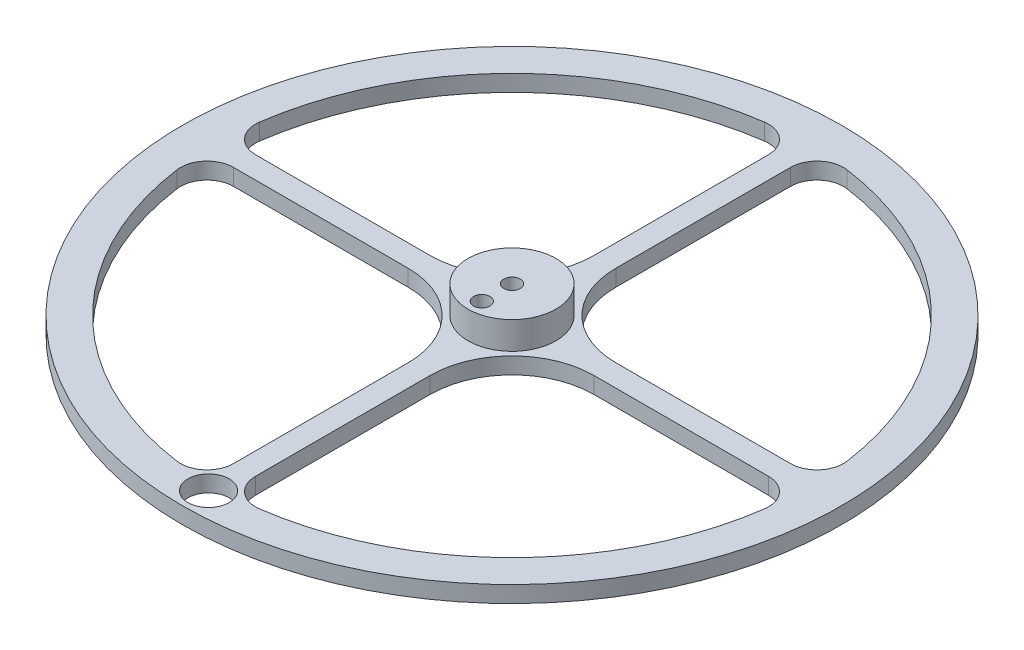
ISO-10303-21;
HEADER;
FILE_DESCRIPTION(('STEP AP214'),'2;1');
FILE_NAME('part.step','',(''),(''),'','','');
FILE_SCHEMA(('AUTOMOTIVE_DESIGN { 1 0 10303 214 1 1 1 1 }'));
ENDSEC;
DATA;
#1=APPLICATION_CONTEXT('core data for automotive mechanical design processes');
#2=APPLICATION_PROTOCOL_DEFINITION('international standard','automotive_design',2000,#1);
#3=PRODUCT_CONTEXT('',#1,'mechanical');
#4=PRODUCT('Part','Part','',(#3));
#5=PRODUCT_RELATED_PRODUCT_CATEGORY('part','',(#4));
#6=PRODUCT_DEFINITION_FORMATION('','',#4);
#7=PRODUCT_DEFINITION_CONTEXT('part definition',#1,'design');
#8=PRODUCT_DEFINITION('design','',#6,#7);
#9=PRODUCT_DEFINITION_SHAPE('','',#8);
#10=(LENGTH_UNIT() NAMED_UNIT(*) SI_UNIT(.MILLI.,.METRE.));
#11=(NAMED_UNIT(*) PLANE_ANGLE_UNIT() SI_UNIT($,.RADIAN.));
#12=(NAMED_UNIT(*) SI_UNIT($,.STERADIAN.) SOLID_ANGLE_UNIT());
#13=UNCERTAINTY_MEASURE_WITH_UNIT(LENGTH_MEASURE(1.E-05),#10,'distance_accuracy_value','');
#14=(GEOMETRIC_REPRESENTATION_CONTEXT(3) GLOBAL_UNCERTAINTY_ASSIGNED_CONTEXT((#13)) GLOBAL_UNIT_ASSIGNED_CONTEXT((#10,
#11,#12)) REPRESENTATION_CONTEXT('',''));
#15=CARTESIAN_POINT('',(0.,0.,0.));
#16=DIRECTION('',(0.,0.,1.));
#17=DIRECTION('',(1.,0.,0.));
#18=AXIS2_PLACEMENT_3D('',#15,#16,#17);
#19=CARTESIAN_POINT('',(0.,0.,0.));
#20=DIRECTION('',(0.,1.,0.));
#21=DIRECTION('',(0.,0.,1.));
#22=AXIS2_PLACEMENT_3D('',#19,#20,#21);
#23=PLANE('',#22);
#24=CARTESIAN_POINT('',(0.,0.,55.25));
#25=DIRECTION('',(0.,1.,0.));
#26=DIRECTION('',(0.,0.,1.));
#27=AXIS2_PLACEMENT_3D('',#24,#25,#26);
#28=CIRCLE('',#27,3.75);
#29=CARTESIAN_POINT('',(0.,0.,59.));
#30=VERTEX_POINT('',#29);
#31=EDGE_CURVE('E680',#30,#30,#28,.T.);
#32=ORIENTED_EDGE('',*,*,#31,.F.);
#33=EDGE_LOOP('',(#32));
#34=FACE_BOUND('',#33,.T.);
#35=CARTESIAN_POINT('',(0.,0.,0.));
#36=DIRECTION('',(0.,1.,0.));
#37=DIRECTION('',(0.,0.,1.));
#38=AXIS2_PLACEMENT_3D('',#35,#36,#37);
#39=CIRCLE('',#38,60.);
#40=CARTESIAN_POINT('',(0.,0.,60.));
#41=VERTEX_POINT('',#40);
#42=EDGE_CURVE('E328',#41,#41,#39,.T.);
#43=ORIENTED_EDGE('',*,*,#42,.T.);
#44=EDGE_LOOP('',(#43));
#45=FACE_BOUND('',#44,.T.);
#46=CARTESIAN_POINT('',(0.,0.,0.));
#47=DIRECTION('',(0.,1.,0.));
#48=DIRECTION('',(0.,0.,1.));
#49=AXIS2_PLACEMENT_3D('',#46,#47,#48);
#50=CIRCLE('',#49,54.);
#51=CARTESIAN_POINT('',(-53.4766304099277,0.,7.49999999999981));
#52=VERTEX_POINT('',#51);
#53=CARTESIAN_POINT('',(-7.5,0.,53.4766304099277));
#54=VERTEX_POINT('',#53);
#55=EDGE_CURVE('E253',#52,#54,#50,.T.);
#56=ORIENTED_EDGE('',*,*,#55,.F.);
#57=CARTESIAN_POINT('',(-48.6941677054723,0.,6.82926831760953));
#58=DIRECTION('',(0.,1.,0.));
#59=DIRECTION('',(0.,0.,1.));
#60=AXIS2_PLACEMENT_3D('',#57,#58,#59);
#61=CIRCLE('',#60,4.8292681132102);
#62=CARTESIAN_POINT('',(-48.6941677054723,0.,2.00000020439934));
#63=VERTEX_POINT('',#62);
#64=EDGE_CURVE('E312',#63,#52,#61,.T.);
#65=ORIENTED_EDGE('',*,*,#64,.F.);
#66=DIRECTION('',(1.,0.,0.));
#67=VECTOR('',#66,1.);
#68=CARTESIAN_POINT('',(0.,0.,2.00000020439951));
#69=LINE('',#68,#67);
#70=CARTESIAN_POINT('',(-16.8994944431475,0.,2.00000020439945));
#71=VERTEX_POINT('',#70);
#72=EDGE_CURVE('E315',#63,#71,#69,.T.);
#73=ORIENTED_EDGE('',*,*,#72,.T.);
#74=CARTESIAN_POINT('',(-16.8994944431475,0.,16.8994944431472));
#75=DIRECTION('',(0.,1.,0.));
#76=DIRECTION('',(0.,0.,1.));
#77=AXIS2_PLACEMENT_3D('',#74,#75,#76);
#78=CIRCLE('',#77,14.8994942387478);
#79=CARTESIAN_POINT('',(-2.00000020439951,0.,16.8994944431475));
#80=VERTEX_POINT('',#79);
#81=EDGE_CURVE('E319',#71,#80,#78,.F.);
#82=ORIENTED_EDGE('',*,*,#81,.T.);
#83=DIRECTION('',(0.,0.,1.));
#84=VECTOR('',#83,1.);
#85=CARTESIAN_POINT('',(-2.00000020439951,0.,0.));
#86=LINE('',#85,#84);
#87=CARTESIAN_POINT('',(-2.00000020439951,0.,48.6941677054723));
#88=VERTEX_POINT('',#87);
#89=EDGE_CURVE('E215',#80,#88,#86,.T.);
#90=ORIENTED_EDGE('',*,*,#89,.T.);
#91=CARTESIAN_POINT('',(-6.8292683176097,0.,48.6941677054723));
#92=DIRECTION('',(0.,1.,0.));
#93=DIRECTION('',(0.,0.,1.));
#94=AXIS2_PLACEMENT_3D('',#91,#92,#93);
#95=CIRCLE('',#94,4.82926811321019);
#96=EDGE_CURVE('E324',#88,#54,#95,.F.);
#97=ORIENTED_EDGE('',*,*,#96,.T.);
#98=EDGE_LOOP('',(#56,#65,#73,#82,#90,#97));
#99=FACE_BOUND('',#98,.T.);
#100=CARTESIAN_POINT('',(-7.49999999999963,0.,-53.4766304099277));
#101=VERTEX_POINT('',#100);
#102=CARTESIAN_POINT('',(-53.4766304099276,0.,-7.50000000000019));
#103=VERTEX_POINT('',#102);
#104=EDGE_CURVE('E292',#101,#103,#50,.T.);
#105=ORIENTED_EDGE('',*,*,#104,.F.);
#106=CARTESIAN_POINT('',(-6.82926831760936,0.,-48.6941677054723));
#107=DIRECTION('',(0.,1.,0.));
#108=DIRECTION('',(0.,0.,1.));
#109=AXIS2_PLACEMENT_3D('',#106,#107,#108);
#110=CIRCLE('',#109,4.82926811321019);
#111=CARTESIAN_POINT('',(-2.00000020439917,0.,-48.6941677054723));
#112=VERTEX_POINT('',#111);
#113=EDGE_CURVE('E293',#112,#101,#110,.T.);
#114=ORIENTED_EDGE('',*,*,#113,.F.);
#115=DIRECTION('',(0.,0.,1.));
#116=VECTOR('',#115,1.);
#117=CARTESIAN_POINT('',(-2.00000020439951,0.,0.));
#118=LINE('',#117,#116);
#119=CARTESIAN_POINT('',(-2.00000020439939,0.,-16.8994944431475));
#120=VERTEX_POINT('',#119);
#121=EDGE_CURVE('E296',#112,#120,#118,.T.);
#122=ORIENTED_EDGE('',*,*,#121,.T.);
#123=CARTESIAN_POINT('',(-16.8994944431472,0.,-16.8994944431476));
#124=DIRECTION('',(0.,1.,0.));
#125=DIRECTION('',(0.,0.,1.));
#126=AXIS2_PLACEMENT_3D('',#123,#124,#125);
#127=CIRCLE('',#126,14.8994942387478);
#128=CARTESIAN_POINT('',(-16.8994944431475,0.,-2.00000020439957));
#129=VERTEX_POINT('',#128);
#130=EDGE_CURVE('E300',#120,#129,#127,.F.);
#131=ORIENTED_EDGE('',*,*,#130,.T.);
#132=DIRECTION('',(-1.,0.,0.));
#133=VECTOR('',#132,1.);
#134=CARTESIAN_POINT('',(0.,0.,-2.00000020439951));
#135=LINE('',#134,#133);
#136=CARTESIAN_POINT('',(-48.6941677054723,0.,-2.00000020439968));
#137=VERTEX_POINT('',#136);
#138=EDGE_CURVE('E304',#129,#137,#135,.T.);
#139=ORIENTED_EDGE('',*,*,#138,.T.);
#140=CARTESIAN_POINT('',(-48.6941677054723,0.,-6.82926831760987));
#141=DIRECTION('',(0.,1.,0.));
#142=DIRECTION('',(0.,0.,1.));
#143=AXIS2_PLACEMENT_3D('',#140,#141,#142);
#144=CIRCLE('',#143,4.82926811321019);
#145=EDGE_CURVE('E308',#137,#103,#144,.F.);
#146=ORIENTED_EDGE('',*,*,#145,.T.);
#147=EDGE_LOOP('',(#105,#114,#122,#131,#139,#146));
#148=FACE_BOUND('',#147,.T.);
#149=CARTESIAN_POINT('',(53.4766304099277,0.,-7.49999999999944));
#150=VERTEX_POINT('',#149);
#151=CARTESIAN_POINT('',(7.50000000000037,0.,-53.4766304099276));
#152=VERTEX_POINT('',#151);
#153=EDGE_CURVE('E254',#150,#152,#50,.T.);
#154=ORIENTED_EDGE('',*,*,#153,.F.);
#155=CARTESIAN_POINT('',(48.6941677054724,0.,-6.82926831760919));
#156=DIRECTION('',(0.,1.,0.));
#157=DIRECTION('',(0.,0.,1.));
#158=AXIS2_PLACEMENT_3D('',#155,#156,#157);
#159=CIRCLE('',#158,4.82926811321019);
#160=CARTESIAN_POINT('',(48.6941677054723,0.,-2.000000204399));
#161=VERTEX_POINT('',#160);
#162=EDGE_CURVE('E273',#161,#150,#159,.T.);
#163=ORIENTED_EDGE('',*,*,#162,.F.);
#164=DIRECTION('',(-1.,0.,0.));
#165=VECTOR('',#164,1.);
#166=CARTESIAN_POINT('',(0.,0.,-2.00000020439951));
#167=LINE('',#166,#165);
#168=CARTESIAN_POINT('',(16.8994944431475,0.,-2.00000020439933));
#169=VERTEX_POINT('',#168);
#170=EDGE_CURVE('E276',#161,#169,#167,.T.);
#171=ORIENTED_EDGE('',*,*,#170,.T.);
#172=CARTESIAN_POINT('',(16.8994944431477,0.,-16.8994944431471));
#173=DIRECTION('',(0.,1.,0.));
#174=DIRECTION('',(0.,0.,1.));
#175=AXIS2_PLACEMENT_3D('',#172,#173,#174);
#176=CIRCLE('',#175,14.8994942387478);
#177=CARTESIAN_POINT('',(2.00000020439962,0.,-16.8994944431475));
#178=VERTEX_POINT('',#177);
#179=EDGE_CURVE('E280',#169,#178,#176,.F.);
#180=ORIENTED_EDGE('',*,*,#179,.T.);
#181=DIRECTION('',(0.,0.,-1.));
#182=VECTOR('',#181,1.);
#183=CARTESIAN_POINT('',(2.0000002043995,0.,0.));
#184=LINE('',#183,#182);
#185=CARTESIAN_POINT('',(2.00000020439984,0.,-48.6941677054723));
#186=VERTEX_POINT('',#185);
#187=EDGE_CURVE('E284',#178,#186,#184,.T.);
#188=ORIENTED_EDGE('',*,*,#187,.T.);
#189=CARTESIAN_POINT('',(6.82926831761003,0.,-48.6941677054722));
#190=DIRECTION('',(0.,1.,0.));
#191=DIRECTION('',(0.,0.,1.));
#192=AXIS2_PLACEMENT_3D('',#189,#190,#191);
#193=CIRCLE('',#192,4.82926811321019);
#194=EDGE_CURVE('E288',#186,#152,#193,.F.);
#195=ORIENTED_EDGE('',*,*,#194,.T.);
#196=EDGE_LOOP('',(#154,#163,#171,#180,#188,#195));
#197=FACE_BOUND('',#196,.T.);
#198=CARTESIAN_POINT('',(7.5,0.,53.4766304099277));
#199=VERTEX_POINT('',#198);
#200=CARTESIAN_POINT('',(53.4766304099276,0.,7.50000000000056));
#201=VERTEX_POINT('',#200);
#202=EDGE_CURVE('E247',#199,#201,#50,.T.);
#203=ORIENTED_EDGE('',*,*,#202,.F.);
#204=CARTESIAN_POINT('',(6.8292683176097,0.,48.6941677054723));
#205=DIRECTION('',(0.,1.,0.));
#206=DIRECTION('',(0.,0.,1.));
#207=AXIS2_PLACEMENT_3D('',#204,#205,#206);
#208=CIRCLE('',#207,4.82926811321019);
#209=CARTESIAN_POINT('',(2.00000020439951,0.,48.6941677054723));
#210=VERTEX_POINT('',#209);
#211=EDGE_CURVE('E251',#210,#199,#208,.T.);
#212=ORIENTED_EDGE('',*,*,#211,.F.);
#213=DIRECTION('',(0.,0.,-1.));
#214=VECTOR('',#213,1.);
#215=CARTESIAN_POINT('',(2.00000020439951,0.,0.));
#216=LINE('',#215,#214);
#217=CARTESIAN_POINT('',(2.00000020439951,0.,16.8994944431475));
#218=VERTEX_POINT('',#217);
#219=EDGE_CURVE('E257',#210,#218,#216,.T.);
#220=ORIENTED_EDGE('',*,*,#219,.T.);
#221=CARTESIAN_POINT('',(16.8994944431473,0.,16.8994944431475));
#222=DIRECTION('',(0.,1.,0.));
#223=DIRECTION('',(0.,0.,1.));
#224=AXIS2_PLACEMENT_3D('',#221,#222,#223);
#225=CIRCLE('',#224,14.8994942387478);
#226=CARTESIAN_POINT('',(16.8994944431475,0.,2.00000020439968));
#227=VERTEX_POINT('',#226);
#228=EDGE_CURVE('E261',#218,#227,#225,.F.);
#229=ORIENTED_EDGE('',*,*,#228,.T.);
#230=DIRECTION('',(1.,0.,0.));
#231=VECTOR('',#230,1.);
#232=CARTESIAN_POINT('',(0.,0.,2.00000020439951));
#233=LINE('',#232,#231);
#234=CARTESIAN_POINT('',(48.6941677054723,0.,2.00000020440002));
#235=VERTEX_POINT('',#234);
#236=EDGE_CURVE('E265',#227,#235,#233,.T.);
#237=ORIENTED_EDGE('',*,*,#236,.T.);
#238=CARTESIAN_POINT('',(48.6941677054722,0.,6.82926831761021));
#239=DIRECTION('',(0.,1.,0.));
#240=DIRECTION('',(0.,0.,1.));
#241=AXIS2_PLACEMENT_3D('',#238,#239,#240);
#242=CIRCLE('',#241,4.82926811321019);
#243=EDGE_CURVE('E269',#235,#201,#242,.F.);
#244=ORIENTED_EDGE('',*,*,#243,.T.);
#245=EDGE_LOOP('',(#203,#212,#220,#229,#237,#244));
#246=FACE_BOUND('',#245,.T.);
#247=CARTESIAN_POINT('',(0.,0.,0.));
#248=DIRECTION('',(0.,1.,0.));
#249=DIRECTION('',(0.,0.,1.));
#250=AXIS2_PLACEMENT_3D('',#247,#248,#249);
#251=CIRCLE('',#250,8.);
#252=CARTESIAN_POINT('',(0.,0.,8.));
#253=VERTEX_POINT('',#252);
#254=EDGE_CURVE('E702',#253,#253,#251,.T.);
#255=ORIENTED_EDGE('',*,*,#254,.F.);
#256=EDGE_LOOP('',(#255));
#257=FACE_BOUND('',#256,.T.);
#258=ADVANCED_FACE('F41',(#34,#45,#99,#148,#197,#246,#257),#23,.T.);
#259=CARTESIAN_POINT('',(0.,-3.,0.));
#260=DIRECTION('',(0.,1.,0.));
#261=DIRECTION('',(0.,0.,1.));
#262=AXIS2_PLACEMENT_3D('',#259,#260,#261);
#263=CYLINDRICAL_SURFACE('',#262,54.);
#264=ORIENTED_EDGE('',*,*,#55,.T.);
#265=DIRECTION('',(0.,1.,0.));
#266=VECTOR('',#265,1.);
#267=CARTESIAN_POINT('',(-7.5,-3.,53.4766304099277));
#268=LINE('',#267,#266);
#269=CARTESIAN_POINT('',(-7.5,-3.,53.4766304099277));
#270=VERTEX_POINT('',#269);
#271=EDGE_CURVE('E11',#270,#54,#268,.T.);
#272=ORIENTED_EDGE('',*,*,#271,.F.);
#273=CARTESIAN_POINT('',(0.,-3.,0.));
#274=DIRECTION('',(0.,1.,0.));
#275=DIRECTION('',(0.,0.,1.));
#276=AXIS2_PLACEMENT_3D('',#273,#274,#275);
#277=CIRCLE('',#276,54.);
#278=CARTESIAN_POINT('',(-53.4766304099277,-3.,7.49999999999981));
#279=VERTEX_POINT('',#278);
#280=EDGE_CURVE('E61',#279,#270,#277,.T.);
#281=ORIENTED_EDGE('',*,*,#280,.F.);
#282=DIRECTION('',(0.,1.,0.));
#283=VECTOR('',#282,1.);
#284=CARTESIAN_POINT('',(-53.4766304099277,-3.,7.49999999999981));
#285=LINE('',#284,#283);
#286=EDGE_CURVE('E340',#279,#52,#285,.T.);
#287=ORIENTED_EDGE('',*,*,#286,.T.);
#288=EDGE_LOOP('',(#264,#272,#281,#287));
#289=FACE_BOUND('',#288,.T.);
#290=ADVANCED_FACE('F500',(#289),#263,.F.);
#291=CARTESIAN_POINT('',(-6.8292683176097,-3.,48.6941677054723));
#292=DIRECTION('',(0.,1.,0.));
#293=DIRECTION('',(0.,0.,1.));
#294=AXIS2_PLACEMENT_3D('',#291,#292,#293);
#295=CYLINDRICAL_SURFACE('',#294,4.82926811321019);
#296=ORIENTED_EDGE('',*,*,#96,.F.);
#297=DIRECTION('',(0.,1.,0.));
#298=VECTOR('',#297,1.);
#299=CARTESIAN_POINT('',(-2.00000020439951,-3.,48.6941677054723));
#300=LINE('',#299,#298);
#301=CARTESIAN_POINT('',(-2.00000020439951,-3.,48.6941677054723));
#302=VERTEX_POINT('',#301);
#303=EDGE_CURVE('E52',#302,#88,#300,.T.);
#304=ORIENTED_EDGE('',*,*,#303,.F.);
#305=CARTESIAN_POINT('',(-6.8292683176097,-3.,48.6941677054723));
#306=DIRECTION('',(0.,1.,0.));
#307=DIRECTION('',(0.,0.,1.));
#308=AXIS2_PLACEMENT_3D('',#305,#306,#307);
#309=CIRCLE('',#308,4.82926811321019);
#310=EDGE_CURVE('E229',#302,#270,#309,.F.);
#311=ORIENTED_EDGE('',*,*,#310,.T.);
#312=ORIENTED_EDGE('',*,*,#271,.T.);
#313=EDGE_LOOP('',(#296,#304,#311,#312));
#314=FACE_BOUND('',#313,.T.);
#315=ADVANCED_FACE('F506',(#314),#295,.F.);
#316=CARTESIAN_POINT('',(-2.00000020439951,-3.,0.));
#317=DIRECTION('',(-1.,0.,0.));
#318=DIRECTION('',(0.,0.,1.));
#319=AXIS2_PLACEMENT_3D('',#316,#317,#318);
#320=PLANE('',#319);
#321=ORIENTED_EDGE('',*,*,#89,.F.);
#322=DIRECTION('',(0.,1.,0.));
#323=VECTOR('',#322,1.);
#324=CARTESIAN_POINT('',(-2.00000020439951,-3.,16.8994944431475));
#325=LINE('',#324,#323);
#326=CARTESIAN_POINT('',(-2.00000020439951,-3.,16.8994944431475));
#327=VERTEX_POINT('',#326);
#328=EDGE_CURVE('E211',#327,#80,#325,.T.);
#329=ORIENTED_EDGE('',*,*,#328,.F.);
#330=DIRECTION('',(0.,0.,1.));
#331=VECTOR('',#330,1.);
#332=CARTESIAN_POINT('',(-2.00000020439951,-3.,0.));
#333=LINE('',#332,#331);
#334=EDGE_CURVE('E214',#327,#302,#333,.T.);
#335=ORIENTED_EDGE('',*,*,#334,.T.);
#336=ORIENTED_EDGE('',*,*,#303,.T.);
#337=EDGE_LOOP('',(#321,#329,#335,#336));
#338=FACE_BOUND('',#337,.T.);
#339=ADVANCED_FACE('F213',(#338),#320,.T.);
#340=CARTESIAN_POINT('',(-16.8994944431475,-3.,16.8994944431472));
#341=DIRECTION('',(0.,1.,0.));
#342=DIRECTION('',(0.,0.,1.));
#343=AXIS2_PLACEMENT_3D('',#340,#341,#342);
#344=CYLINDRICAL_SURFACE('',#343,14.8994942387478);
#345=ORIENTED_EDGE('',*,*,#81,.F.);
#346=DIRECTION('',(0.,1.,0.));
#347=VECTOR('',#346,1.);
#348=CARTESIAN_POINT('',(-16.8994944431475,-3.,2.00000020439945));
#349=LINE('',#348,#347);
#350=CARTESIAN_POINT('',(-16.8994944431475,-3.,2.00000020439945));
#351=VERTEX_POINT('',#350);
#352=EDGE_CURVE('E221',#351,#71,#349,.T.);
#353=ORIENTED_EDGE('',*,*,#352,.F.);
#354=CARTESIAN_POINT('',(-16.8994944431475,-3.,16.8994944431472));
#355=DIRECTION('',(0.,1.,0.));
#356=DIRECTION('',(0.,0.,1.));
#357=AXIS2_PLACEMENT_3D('',#354,#355,#356);
#358=CIRCLE('',#357,14.8994942387478);
#359=EDGE_CURVE('E227',#351,#327,#358,.F.);
#360=ORIENTED_EDGE('',*,*,#359,.T.);
#361=ORIENTED_EDGE('',*,*,#328,.T.);
#362=EDGE_LOOP('',(#345,#353,#360,#361));
#363=FACE_BOUND('',#362,.T.);
#364=ADVANCED_FACE('F232',(#363),#344,.F.);
#365=CARTESIAN_POINT('',(0.,-3.,2.00000020439951));
#366=DIRECTION('',(0.,0.,1.));
#367=DIRECTION('',(1.,0.,0.));
#368=AXIS2_PLACEMENT_3D('',#365,#366,#367);
#369=PLANE('',#368);
#370=ORIENTED_EDGE('',*,*,#72,.F.);
#371=DIRECTION('',(0.,1.,0.));
#372=VECTOR('',#371,1.);
#373=CARTESIAN_POINT('',(-48.6941677054723,-3.,2.00000020439934));
#374=LINE('',#373,#372);
#375=CARTESIAN_POINT('',(-48.6941677054723,-3.,2.00000020439934));
#376=VERTEX_POINT('',#375);
#377=EDGE_CURVE('E337',#376,#63,#374,.T.);
#378=ORIENTED_EDGE('',*,*,#377,.F.);
#379=DIRECTION('',(1.,0.,0.));
#380=VECTOR('',#379,1.);
#381=CARTESIAN_POINT('',(0.,-3.,2.00000020439951));
#382=LINE('',#381,#380);
#383=EDGE_CURVE('E234',#376,#351,#382,.T.);
#384=ORIENTED_EDGE('',*,*,#383,.T.);
#385=ORIENTED_EDGE('',*,*,#352,.T.);
#386=EDGE_LOOP('',(#370,#378,#384,#385));
#387=FACE_BOUND('',#386,.T.);
#388=ADVANCED_FACE('F521',(#387),#369,.T.);
#389=ORIENTED_EDGE('',*,*,#104,.T.);
#390=DIRECTION('',(0.,1.,0.));
#391=VECTOR('',#390,1.);
#392=CARTESIAN_POINT('',(-53.4766304099276,-3.,-7.50000000000019));
#393=LINE('',#392,#391);
#394=CARTESIAN_POINT('',(-53.4766304099276,-3.,-7.50000000000019));
#395=VERTEX_POINT('',#394);
#396=EDGE_CURVE('E344',#395,#103,#393,.T.);
#397=ORIENTED_EDGE('',*,*,#396,.F.);
#398=CARTESIAN_POINT('',(-7.49999999999963,-3.,-53.4766304099277));
#399=VERTEX_POINT('',#398);
#400=EDGE_CURVE('E424',#399,#395,#277,.T.);
#401=ORIENTED_EDGE('',*,*,#400,.F.);
#402=DIRECTION('',(0.,1.,0.));
#403=VECTOR('',#402,1.);
#404=CARTESIAN_POINT('',(-7.49999999999963,-3.,-53.4766304099277));
#405=LINE('',#404,#403);
#406=EDGE_CURVE('E359',#399,#101,#405,.T.);
#407=ORIENTED_EDGE('',*,*,#406,.T.);
#408=EDGE_LOOP('',(#389,#397,#401,#407));
#409=FACE_BOUND('',#408,.T.);
#410=ADVANCED_FACE('F509',(#409),#263,.F.);
#411=CARTESIAN_POINT('',(-48.6941677054723,-3.,-6.82926831760987));
#412=DIRECTION('',(0.,1.,0.));
#413=DIRECTION('',(0.,0.,1.));
#414=AXIS2_PLACEMENT_3D('',#411,#412,#413);
#415=CYLINDRICAL_SURFACE('',#414,4.82926811321019);
#416=ORIENTED_EDGE('',*,*,#145,.F.);
#417=DIRECTION('',(0.,1.,0.));
#418=VECTOR('',#417,1.);
#419=CARTESIAN_POINT('',(-48.6941677054723,-3.,-2.00000020439968));
#420=LINE('',#419,#418);
#421=CARTESIAN_POINT('',(-48.6941677054723,-3.,-2.00000020439968));
#422=VERTEX_POINT('',#421);
#423=EDGE_CURVE('E347',#422,#137,#420,.T.);
#424=ORIENTED_EDGE('',*,*,#423,.F.);
#425=CARTESIAN_POINT('',(-48.6941677054723,-3.,-6.82926831760987));
#426=DIRECTION('',(0.,1.,0.));
#427=DIRECTION('',(0.,0.,1.));
#428=AXIS2_PLACEMENT_3D('',#425,#426,#427);
#429=CIRCLE('',#428,4.82926811321019);
#430=EDGE_CURVE('E462',#422,#395,#429,.F.);
#431=ORIENTED_EDGE('',*,*,#430,.T.);
#432=ORIENTED_EDGE('',*,*,#396,.T.);
#433=EDGE_LOOP('',(#416,#424,#431,#432));
#434=FACE_BOUND('',#433,.T.);
#435=ADVANCED_FACE('F529',(#434),#415,.F.);
#436=CARTESIAN_POINT('',(0.,-3.,-2.00000020439951));
#437=DIRECTION('',(0.,0.,-1.));
#438=DIRECTION('',(-1.,0.,0.));
#439=AXIS2_PLACEMENT_3D('',#436,#437,#438);
#440=PLANE('',#439);
#441=ORIENTED_EDGE('',*,*,#138,.F.);
#442=DIRECTION('',(0.,1.,0.));
#443=VECTOR('',#442,1.);
#444=CARTESIAN_POINT('',(-16.8994944431475,-3.,-2.00000020439957));
#445=LINE('',#444,#443);
#446=CARTESIAN_POINT('',(-16.8994944431475,-3.,-2.00000020439957));
#447=VERTEX_POINT('',#446);
#448=EDGE_CURVE('E350',#447,#129,#445,.T.);
#449=ORIENTED_EDGE('',*,*,#448,.F.);
#450=DIRECTION('',(-1.,0.,0.));
#451=VECTOR('',#450,1.);
#452=CARTESIAN_POINT('',(0.,-3.,-2.00000020439951));
#453=LINE('',#452,#451);
#454=EDGE_CURVE('E458',#447,#422,#453,.T.);
#455=ORIENTED_EDGE('',*,*,#454,.T.);
#456=ORIENTED_EDGE('',*,*,#423,.T.);
#457=EDGE_LOOP('',(#441,#449,#455,#456));
#458=FACE_BOUND('',#457,.T.);
#459=ADVANCED_FACE('F532',(#458),#440,.T.);
#460=CARTESIAN_POINT('',(-16.8994944431472,-3.,-16.8994944431476));
#461=DIRECTION('',(0.,1.,0.));
#462=DIRECTION('',(0.,0.,1.));
#463=AXIS2_PLACEMENT_3D('',#460,#461,#462);
#464=CYLINDRICAL_SURFACE('',#463,14.8994942387478);
#465=ORIENTED_EDGE('',*,*,#130,.F.);
#466=DIRECTION('',(0.,1.,0.));
#467=VECTOR('',#466,1.);
#468=CARTESIAN_POINT('',(-2.00000020439939,-3.,-16.8994944431475));
#469=LINE('',#468,#467);
#470=CARTESIAN_POINT('',(-2.00000020439939,-3.,-16.8994944431475));
#471=VERTEX_POINT('',#470);
#472=EDGE_CURVE('E353',#471,#120,#469,.T.);
#473=ORIENTED_EDGE('',*,*,#472,.F.);
#474=CARTESIAN_POINT('',(-16.8994944431472,-3.,-16.8994944431476));
#475=DIRECTION('',(0.,1.,0.));
#476=DIRECTION('',(0.,0.,1.));
#477=AXIS2_PLACEMENT_3D('',#474,#475,#476);
#478=CIRCLE('',#477,14.8994942387478);
#479=EDGE_CURVE('E454',#471,#447,#478,.F.);
#480=ORIENTED_EDGE('',*,*,#479,.T.);
#481=ORIENTED_EDGE('',*,*,#448,.T.);
#482=EDGE_LOOP('',(#465,#473,#480,#481));
#483=FACE_BOUND('',#482,.T.);
#484=ADVANCED_FACE('F536',(#483),#464,.F.);
#485=CARTESIAN_POINT('',(-2.00000020439951,-3.,0.));
#486=DIRECTION('',(-1.,0.,0.));
#487=DIRECTION('',(0.,0.,1.));
#488=AXIS2_PLACEMENT_3D('',#485,#486,#487);
#489=PLANE('',#488);
#490=ORIENTED_EDGE('',*,*,#121,.F.);
#491=DIRECTION('',(0.,1.,0.));
#492=VECTOR('',#491,1.);
#493=CARTESIAN_POINT('',(-2.00000020439917,-3.,-48.6941677054723));
#494=LINE('',#493,#492);
#495=CARTESIAN_POINT('',(-2.00000020439917,-3.,-48.6941677054723));
#496=VERTEX_POINT('',#495);
#497=EDGE_CURVE('E356',#496,#112,#494,.T.);
#498=ORIENTED_EDGE('',*,*,#497,.F.);
#499=DIRECTION('',(0.,0.,1.));
#500=VECTOR('',#499,1.);
#501=CARTESIAN_POINT('',(-2.00000020439951,-3.,0.));
#502=LINE('',#501,#500);
#503=EDGE_CURVE('E450',#496,#471,#502,.T.);
#504=ORIENTED_EDGE('',*,*,#503,.T.);
#505=ORIENTED_EDGE('',*,*,#472,.T.);
#506=EDGE_LOOP('',(#490,#498,#504,#505));
#507=FACE_BOUND('',#506,.T.);
#508=ADVANCED_FACE('F540',(#507),#489,.T.);
#509=ORIENTED_EDGE('',*,*,#153,.T.);
#510=DIRECTION('',(0.,1.,0.));
#511=VECTOR('',#510,1.);
#512=CARTESIAN_POINT('',(7.50000000000037,-3.,-53.4766304099276));
#513=LINE('',#512,#511);
#514=CARTESIAN_POINT('',(7.50000000000037,-3.,-53.4766304099276));
#515=VERTEX_POINT('',#514);
#516=EDGE_CURVE('E363',#515,#152,#513,.T.);
#517=ORIENTED_EDGE('',*,*,#516,.F.);
#518=CARTESIAN_POINT('',(53.4766304099277,-3.,-7.49999999999944));
#519=VERTEX_POINT('',#518);
#520=EDGE_CURVE('E417',#519,#515,#277,.T.);
#521=ORIENTED_EDGE('',*,*,#520,.F.);
#522=DIRECTION('',(0.,1.,0.));
#523=VECTOR('',#522,1.);
#524=CARTESIAN_POINT('',(53.4766304099277,-3.,-7.49999999999944));
#525=LINE('',#524,#523);
#526=EDGE_CURVE('E378',#519,#150,#525,.T.);
#527=ORIENTED_EDGE('',*,*,#526,.T.);
#528=EDGE_LOOP('',(#509,#517,#521,#527));
#529=FACE_BOUND('',#528,.T.);
#530=ADVANCED_FACE('F544',(#529),#263,.F.);
#531=CARTESIAN_POINT('',(6.82926831761003,-3.,-48.6941677054722));
#532=DIRECTION('',(0.,1.,0.));
#533=DIRECTION('',(0.,0.,1.));
#534=AXIS2_PLACEMENT_3D('',#531,#532,#533);
#535=CYLINDRICAL_SURFACE('',#534,4.82926811321019);
#536=ORIENTED_EDGE('',*,*,#194,.F.);
#537=DIRECTION('',(0.,1.,0.));
#538=VECTOR('',#537,1.);
#539=CARTESIAN_POINT('',(2.00000020439984,-3.,-48.6941677054723));
#540=LINE('',#539,#538);
#541=CARTESIAN_POINT('',(2.00000020439984,-3.,-48.6941677054723));
#542=VERTEX_POINT('',#541);
#543=EDGE_CURVE('E366',#542,#186,#540,.T.);
#544=ORIENTED_EDGE('',*,*,#543,.F.);
#545=CARTESIAN_POINT('',(6.82926831761003,-3.,-48.6941677054722));
#546=DIRECTION('',(0.,1.,0.));
#547=DIRECTION('',(0.,0.,1.));
#548=AXIS2_PLACEMENT_3D('',#545,#546,#547);
#549=CIRCLE('',#548,4.82926811321019);
#550=EDGE_CURVE('E443',#542,#515,#549,.F.);
#551=ORIENTED_EDGE('',*,*,#550,.T.);
#552=ORIENTED_EDGE('',*,*,#516,.T.);
#553=EDGE_LOOP('',(#536,#544,#551,#552));
#554=FACE_BOUND('',#553,.T.);
#555=ADVANCED_FACE('F549',(#554),#535,.F.);
#556=CARTESIAN_POINT('',(2.0000002043995,-3.,0.));
#557=DIRECTION('',(1.,0.,0.));
#558=DIRECTION('',(0.,0.,-1.));
#559=AXIS2_PLACEMENT_3D('',#556,#557,#558);
#560=PLANE('',#559);
#561=ORIENTED_EDGE('',*,*,#187,.F.);
#562=DIRECTION('',(0.,1.,0.));
#563=VECTOR('',#562,1.);
#564=CARTESIAN_POINT('',(2.00000020439962,-3.,-16.8994944431475));
#565=LINE('',#564,#563);
#566=CARTESIAN_POINT('',(2.00000020439962,-3.,-16.8994944431475));
#567=VERTEX_POINT('',#566);
#568=EDGE_CURVE('E369',#567,#178,#565,.T.);
#569=ORIENTED_EDGE('',*,*,#568,.F.);
#570=DIRECTION('',(0.,0.,-1.));
#571=VECTOR('',#570,1.);
#572=CARTESIAN_POINT('',(2.0000002043995,-3.,0.));
#573=LINE('',#572,#571);
#574=EDGE_CURVE('E439',#567,#542,#573,.T.);
#575=ORIENTED_EDGE('',*,*,#574,.T.);
#576=ORIENTED_EDGE('',*,*,#543,.T.);
#577=EDGE_LOOP('',(#561,#569,#575,#576));
#578=FACE_BOUND('',#577,.T.);
#579=ADVANCED_FACE('F552',(#578),#560,.T.);
#580=CARTESIAN_POINT('',(16.8994944431477,-3.,-16.8994944431471));
#581=DIRECTION('',(0.,1.,0.));
#582=DIRECTION('',(0.,0.,1.));
#583=AXIS2_PLACEMENT_3D('',#580,#581,#582);
#584=CYLINDRICAL_SURFACE('',#583,14.8994942387478);
#585=ORIENTED_EDGE('',*,*,#179,.F.);
#586=DIRECTION('',(0.,1.,0.));
#587=VECTOR('',#586,1.);
#588=CARTESIAN_POINT('',(16.8994944431475,-3.,-2.00000020439933));
#589=LINE('',#588,#587);
#590=CARTESIAN_POINT('',(16.8994944431475,-3.,-2.00000020439933));
#591=VERTEX_POINT('',#590);
#592=EDGE_CURVE('E372',#591,#169,#589,.T.);
#593=ORIENTED_EDGE('',*,*,#592,.F.);
#594=CARTESIAN_POINT('',(16.8994944431477,-3.,-16.8994944431471));
#595=DIRECTION('',(0.,1.,0.));
#596=DIRECTION('',(0.,0.,1.));
#597=AXIS2_PLACEMENT_3D('',#594,#595,#596);
#598=CIRCLE('',#597,14.8994942387478);
#599=EDGE_CURVE('E435',#591,#567,#598,.F.);
#600=ORIENTED_EDGE('',*,*,#599,.T.);
#601=ORIENTED_EDGE('',*,*,#568,.T.);
#602=EDGE_LOOP('',(#585,#593,#600,#601));
#603=FACE_BOUND('',#602,.T.);
#604=ADVANCED_FACE('F556',(#603),#584,.F.);
#605=CARTESIAN_POINT('',(0.,-3.,-2.00000020439951));
#606=DIRECTION('',(0.,0.,-1.));
#607=DIRECTION('',(-1.,0.,0.));
#608=AXIS2_PLACEMENT_3D('',#605,#606,#607);
#609=PLANE('',#608);
#610=ORIENTED_EDGE('',*,*,#170,.F.);
#611=DIRECTION('',(0.,1.,0.));
#612=VECTOR('',#611,1.);
#613=CARTESIAN_POINT('',(48.6941677054723,-3.,-2.000000204399));
#614=LINE('',#613,#612);
#615=CARTESIAN_POINT('',(48.6941677054723,-3.,-2.000000204399));
#616=VERTEX_POINT('',#615);
#617=EDGE_CURVE('E375',#616,#161,#614,.T.);
#618=ORIENTED_EDGE('',*,*,#617,.F.);
#619=DIRECTION('',(-1.,0.,0.));
#620=VECTOR('',#619,1.);
#621=CARTESIAN_POINT('',(0.,-3.,-2.00000020439951));
#622=LINE('',#621,#620);
#623=EDGE_CURVE('E431',#616,#591,#622,.T.);
#624=ORIENTED_EDGE('',*,*,#623,.T.);
#625=ORIENTED_EDGE('',*,*,#592,.T.);
#626=EDGE_LOOP('',(#610,#618,#624,#625));
#627=FACE_BOUND('',#626,.T.);
#628=ADVANCED_FACE('F560',(#627),#609,.T.);
#629=ORIENTED_EDGE('',*,*,#202,.T.);
#630=DIRECTION('',(0.,1.,0.));
#631=VECTOR('',#630,1.);
#632=CARTESIAN_POINT('',(53.4766304099276,-3.,7.50000000000056));
#633=LINE('',#632,#631);
#634=CARTESIAN_POINT('',(53.4766304099276,-3.,7.50000000000056));
#635=VERTEX_POINT('',#634);
#636=EDGE_CURVE('E382',#635,#201,#633,.T.);
#637=ORIENTED_EDGE('',*,*,#636,.F.);
#638=CARTESIAN_POINT('',(7.5,-3.,53.4766304099277));
#639=VERTEX_POINT('',#638);
#640=EDGE_CURVE('E331',#639,#635,#277,.T.);
#641=ORIENTED_EDGE('',*,*,#640,.F.);
#642=DIRECTION('',(0.,1.,0.));
#643=VECTOR('',#642,1.);
#644=CARTESIAN_POINT('',(7.5,-3.,53.4766304099277));
#645=LINE('',#644,#643);
#646=EDGE_CURVE('E45',#639,#199,#645,.T.);
#647=ORIENTED_EDGE('',*,*,#646,.T.);
#648=EDGE_LOOP('',(#629,#637,#641,#647));
#649=FACE_BOUND('',#648,.T.);
#650=ADVANCED_FACE('F402',(#649),#263,.F.);
#651=CARTESIAN_POINT('',(48.6941677054722,-3.,6.82926831761021));
#652=DIRECTION('',(0.,1.,0.));
#653=DIRECTION('',(0.,0.,1.));
#654=AXIS2_PLACEMENT_3D('',#651,#652,#653);
#655=CYLINDRICAL_SURFACE('',#654,4.82926811321019);
#656=ORIENTED_EDGE('',*,*,#243,.F.);
#657=DIRECTION('',(0.,1.,0.));
#658=VECTOR('',#657,1.);
#659=CARTESIAN_POINT('',(48.6941677054723,-3.,2.00000020440002));
#660=LINE('',#659,#658);
#661=CARTESIAN_POINT('',(48.6941677054723,-3.,2.00000020440002));
#662=VERTEX_POINT('',#661);
#663=EDGE_CURVE('E385',#662,#235,#660,.T.);
#664=ORIENTED_EDGE('',*,*,#663,.F.);
#665=CARTESIAN_POINT('',(48.6941677054722,-3.,6.82926831761021));
#666=DIRECTION('',(0.,1.,0.));
#667=DIRECTION('',(0.,0.,1.));
#668=AXIS2_PLACEMENT_3D('',#665,#666,#667);
#669=CIRCLE('',#668,4.82926811321019);
#670=EDGE_CURVE('E414',#662,#635,#669,.F.);
#671=ORIENTED_EDGE('',*,*,#670,.T.);
#672=ORIENTED_EDGE('',*,*,#636,.T.);
#673=EDGE_LOOP('',(#656,#664,#671,#672));
#674=FACE_BOUND('',#673,.T.);
#675=ADVANCED_FACE('F410',(#674),#655,.F.);
#676=CARTESIAN_POINT('',(0.,-3.,2.00000020439951));
#677=DIRECTION('',(0.,0.,1.));
#678=DIRECTION('',(1.,0.,0.));
#679=AXIS2_PLACEMENT_3D('',#676,#677,#678);
#680=PLANE('',#679);
#681=ORIENTED_EDGE('',*,*,#236,.F.);
#682=DIRECTION('',(0.,1.,0.));
#683=VECTOR('',#682,1.);
#684=CARTESIAN_POINT('',(16.8994944431475,-3.,2.00000020439968));
#685=LINE('',#684,#683);
#686=CARTESIAN_POINT('',(16.8994944431475,-3.,2.00000020439968));
#687=VERTEX_POINT('',#686);
#688=EDGE_CURVE('E388',#687,#227,#685,.T.);
#689=ORIENTED_EDGE('',*,*,#688,.F.);
#690=DIRECTION('',(1.,0.,0.));
#691=VECTOR('',#690,1.);
#692=CARTESIAN_POINT('',(0.,-3.,2.00000020439951));
#693=LINE('',#692,#691);
#694=EDGE_CURVE('E418',#687,#662,#693,.T.);
#695=ORIENTED_EDGE('',*,*,#694,.T.);
#696=ORIENTED_EDGE('',*,*,#663,.T.);
#697=EDGE_LOOP('',(#681,#689,#695,#696));
#698=FACE_BOUND('',#697,.T.);
#699=ADVANCED_FACE('F567',(#698),#680,.T.);
#700=CARTESIAN_POINT('',(16.8994944431473,-3.,16.8994944431475));
#701=DIRECTION('',(0.,1.,0.));
#702=DIRECTION('',(0.,0.,1.));
#703=AXIS2_PLACEMENT_3D('',#700,#701,#702);
#704=CYLINDRICAL_SURFACE('',#703,14.8994942387478);
#705=ORIENTED_EDGE('',*,*,#228,.F.);
#706=DIRECTION('',(0.,1.,0.));
#707=VECTOR('',#706,1.);
#708=CARTESIAN_POINT('',(2.00000020439951,-3.,16.8994944431475));
#709=LINE('',#708,#707);
#710=CARTESIAN_POINT('',(2.00000020439951,-3.,16.8994944431475));
#711=VERTEX_POINT('',#710);
#712=EDGE_CURVE('E391',#711,#218,#709,.T.);
#713=ORIENTED_EDGE('',*,*,#712,.F.);
#714=CARTESIAN_POINT('',(16.8994944431473,-3.,16.8994944431475));
#715=DIRECTION('',(0.,1.,0.));
#716=DIRECTION('',(0.,0.,1.));
#717=AXIS2_PLACEMENT_3D('',#714,#715,#716);
#718=CIRCLE('',#717,14.8994942387478);
#719=EDGE_CURVE('E425',#711,#687,#718,.F.);
#720=ORIENTED_EDGE('',*,*,#719,.T.);
#721=ORIENTED_EDGE('',*,*,#688,.T.);
#722=EDGE_LOOP('',(#705,#713,#720,#721));
#723=FACE_BOUND('',#722,.T.);
#724=ADVANCED_FACE('F483',(#723),#704,.F.);
#725=CARTESIAN_POINT('',(2.00000020439951,-3.,0.));
#726=DIRECTION('',(1.,0.,0.));
#727=DIRECTION('',(0.,0.,-1.));
#728=AXIS2_PLACEMENT_3D('',#725,#726,#727);
#729=PLANE('',#728);
#730=ORIENTED_EDGE('',*,*,#219,.F.);
#731=DIRECTION('',(0.,1.,0.));
#732=VECTOR('',#731,1.);
#733=CARTESIAN_POINT('',(2.00000020439951,-3.,48.6941677054723));
#734=LINE('',#733,#732);
#735=CARTESIAN_POINT('',(2.00000020439951,-3.,48.6941677054723));
#736=VERTEX_POINT('',#735);
#737=EDGE_CURVE('E393',#736,#210,#734,.T.);
#738=ORIENTED_EDGE('',*,*,#737,.F.);
#739=DIRECTION('',(0.,0.,-1.));
#740=VECTOR('',#739,1.);
#741=CARTESIAN_POINT('',(2.00000020439951,-3.,0.));
#742=LINE('',#741,#740);
#743=EDGE_CURVE('E474',#736,#711,#742,.T.);
#744=ORIENTED_EDGE('',*,*,#743,.T.);
#745=ORIENTED_EDGE('',*,*,#712,.T.);
#746=EDGE_LOOP('',(#730,#738,#744,#745));
#747=FACE_BOUND('',#746,.T.);
#748=ADVANCED_FACE('F486',(#747),#729,.T.);
#749=CARTESIAN_POINT('',(-48.6941677054723,-3.,6.82926831760953));
#750=DIRECTION('',(0.,1.,0.));
#751=DIRECTION('',(0.,0.,1.));
#752=AXIS2_PLACEMENT_3D('',#749,#750,#751);
#753=CYLINDRICAL_SURFACE('',#752,4.8292681132102);
#754=ORIENTED_EDGE('',*,*,#64,.T.);
#755=ORIENTED_EDGE('',*,*,#286,.F.);
#756=CARTESIAN_POINT('',(-48.6941677054723,-3.,6.82926831760953));
#757=DIRECTION('',(0.,1.,0.));
#758=DIRECTION('',(0.,0.,1.));
#759=AXIS2_PLACEMENT_3D('',#756,#757,#758);
#760=CIRCLE('',#759,4.8292681132102);
#761=EDGE_CURVE('E237',#376,#279,#760,.T.);
#762=ORIENTED_EDGE('',*,*,#761,.F.);
#763=ORIENTED_EDGE('',*,*,#377,.T.);
#764=EDGE_LOOP('',(#754,#755,#762,#763));
#765=FACE_BOUND('',#764,.T.);
#766=ADVANCED_FACE('F525',(#765),#753,.F.);
#767=CARTESIAN_POINT('',(-6.82926831760936,-3.,-48.6941677054723));
#768=DIRECTION('',(0.,1.,0.));
#769=DIRECTION('',(0.,0.,1.));
#770=AXIS2_PLACEMENT_3D('',#767,#768,#769);
#771=CYLINDRICAL_SURFACE('',#770,4.82926811321019);
#772=ORIENTED_EDGE('',*,*,#113,.T.);
#773=ORIENTED_EDGE('',*,*,#406,.F.);
#774=CARTESIAN_POINT('',(-6.82926831760936,-3.,-48.6941677054723));
#775=DIRECTION('',(0.,1.,0.));
#776=DIRECTION('',(0.,0.,1.));
#777=AXIS2_PLACEMENT_3D('',#774,#775,#776);
#778=CIRCLE('',#777,4.82926811321019);
#779=EDGE_CURVE('E447',#496,#399,#778,.T.);
#780=ORIENTED_EDGE('',*,*,#779,.F.);
#781=ORIENTED_EDGE('',*,*,#497,.T.);
#782=EDGE_LOOP('',(#772,#773,#780,#781));
#783=FACE_BOUND('',#782,.T.);
#784=ADVANCED_FACE('F496',(#783),#771,.F.);
#785=CARTESIAN_POINT('',(48.6941677054724,-3.,-6.82926831760919));
#786=DIRECTION('',(0.,1.,0.));
#787=DIRECTION('',(0.,0.,1.));
#788=AXIS2_PLACEMENT_3D('',#785,#786,#787);
#789=CYLINDRICAL_SURFACE('',#788,4.82926811321019);
#790=ORIENTED_EDGE('',*,*,#162,.T.);
#791=ORIENTED_EDGE('',*,*,#526,.F.);
#792=CARTESIAN_POINT('',(48.6941677054724,-3.,-6.82926831760919));
#793=DIRECTION('',(0.,1.,0.));
#794=DIRECTION('',(0.,0.,1.));
#795=AXIS2_PLACEMENT_3D('',#792,#793,#794);
#796=CIRCLE('',#795,4.82926811321019);
#797=EDGE_CURVE('E422',#616,#519,#796,.T.);
#798=ORIENTED_EDGE('',*,*,#797,.F.);
#799=ORIENTED_EDGE('',*,*,#617,.T.);
#800=EDGE_LOOP('',(#790,#791,#798,#799));
#801=FACE_BOUND('',#800,.T.);
#802=ADVANCED_FACE('F489',(#801),#789,.F.);
#803=CARTESIAN_POINT('',(6.8292683176097,-3.,48.6941677054723));
#804=DIRECTION('',(0.,1.,0.));
#805=DIRECTION('',(0.,0.,1.));
#806=AXIS2_PLACEMENT_3D('',#803,#804,#805);
#807=CYLINDRICAL_SURFACE('',#806,4.82926811321019);
#808=ORIENTED_EDGE('',*,*,#211,.T.);
#809=ORIENTED_EDGE('',*,*,#646,.F.);
#810=CARTESIAN_POINT('',(6.8292683176097,-3.,48.6941677054723));
#811=DIRECTION('',(0.,1.,0.));
#812=DIRECTION('',(0.,0.,1.));
#813=AXIS2_PLACEMENT_3D('',#810,#811,#812);
#814=CIRCLE('',#813,4.82926811321019);
#815=EDGE_CURVE('E151',#736,#639,#814,.T.);
#816=ORIENTED_EDGE('',*,*,#815,.F.);
#817=ORIENTED_EDGE('',*,*,#737,.T.);
#818=EDGE_LOOP('',(#808,#809,#816,#817));
#819=FACE_BOUND('',#818,.T.);
#820=ADVANCED_FACE('F43',(#819),#807,.F.);
#821=CARTESIAN_POINT('',(0.,-3.,0.));
#822=DIRECTION('',(0.,1.,0.));
#823=DIRECTION('',(0.,0.,1.));
#824=AXIS2_PLACEMENT_3D('',#821,#822,#823);
#825=CYLINDRICAL_SURFACE('',#824,60.);
#826=CARTESIAN_POINT('',(0.,-3.,0.));
#827=DIRECTION('',(0.,1.,0.));
#828=DIRECTION('',(0.,0.,1.));
#829=AXIS2_PLACEMENT_3D('',#826,#827,#828);
#830=CIRCLE('',#829,60.);
#831=CARTESIAN_POINT('',(0.,-3.,60.));
#832=VERTEX_POINT('',#831);
#833=EDGE_CURVE('E243',#832,#832,#830,.T.);
#834=ORIENTED_EDGE('',*,*,#833,.T.);
#835=EDGE_LOOP('',(#834));
#836=FACE_BOUND('',#835,.T.);
#837=ORIENTED_EDGE('',*,*,#42,.F.);
#838=EDGE_LOOP('',(#837));
#839=FACE_BOUND('',#838,.T.);
#840=ADVANCED_FACE('F488',(#836,#839),#825,.T.);
#841=CARTESIAN_POINT('',(0.,-3.,0.));
#842=DIRECTION('',(0.,1.,0.));
#843=DIRECTION('',(0.,0.,1.));
#844=AXIS2_PLACEMENT_3D('',#841,#842,#843);
#845=PLANE('',#844);
#846=CARTESIAN_POINT('',(0.,-3.,55.25));
#847=DIRECTION('',(0.,1.,0.));
#848=DIRECTION('',(0.,0.,1.));
#849=AXIS2_PLACEMENT_3D('',#846,#847,#848);
#850=CIRCLE('',#849,3.75);
#851=CARTESIAN_POINT('',(0.,-3.,59.));
#852=VERTEX_POINT('',#851);
#853=EDGE_CURVE('E686',#852,#852,#850,.F.);
#854=ORIENTED_EDGE('',*,*,#853,.F.);
#855=EDGE_LOOP('',(#854));
#856=FACE_BOUND('',#855,.T.);
#857=CARTESIAN_POINT('',(0.,-3.,0.));
#858=DIRECTION('',(0.,1.,0.));
#859=DIRECTION('',(0.,0.,1.));
#860=AXIS2_PLACEMENT_3D('',#857,#858,#859);
#861=CIRCLE('',#860,1.5);
#862=CARTESIAN_POINT('',(0.,-3.,1.5));
#863=VERTEX_POINT('',#862);
#864=EDGE_CURVE('E698',#863,#863,#861,.F.);
#865=ORIENTED_EDGE('',*,*,#864,.F.);
#866=EDGE_LOOP('',(#865));
#867=FACE_BOUND('',#866,.T.);
#868=ORIENTED_EDGE('',*,*,#640,.T.);
#869=ORIENTED_EDGE('',*,*,#670,.F.);
#870=ORIENTED_EDGE('',*,*,#694,.F.);
#871=ORIENTED_EDGE('',*,*,#719,.F.);
#872=ORIENTED_EDGE('',*,*,#743,.F.);
#873=ORIENTED_EDGE('',*,*,#815,.T.);
#874=EDGE_LOOP('',(#868,#869,#870,#871,#872,#873));
#875=FACE_BOUND('',#874,.T.);
#876=ORIENTED_EDGE('',*,*,#520,.T.);
#877=ORIENTED_EDGE('',*,*,#550,.F.);
#878=ORIENTED_EDGE('',*,*,#574,.F.);
#879=ORIENTED_EDGE('',*,*,#599,.F.);
#880=ORIENTED_EDGE('',*,*,#623,.F.);
#881=ORIENTED_EDGE('',*,*,#797,.T.);
#882=EDGE_LOOP('',(#876,#877,#878,#879,#880,#881));
#883=FACE_BOUND('',#882,.T.);
#884=ORIENTED_EDGE('',*,*,#400,.T.);
#885=ORIENTED_EDGE('',*,*,#430,.F.);
#886=ORIENTED_EDGE('',*,*,#454,.F.);
#887=ORIENTED_EDGE('',*,*,#479,.F.);
#888=ORIENTED_EDGE('',*,*,#503,.F.);
#889=ORIENTED_EDGE('',*,*,#779,.T.);
#890=EDGE_LOOP('',(#884,#885,#886,#887,#888,#889));
#891=FACE_BOUND('',#890,.T.);
#892=ORIENTED_EDGE('',*,*,#280,.T.);
#893=ORIENTED_EDGE('',*,*,#310,.F.);
#894=ORIENTED_EDGE('',*,*,#334,.F.);
#895=ORIENTED_EDGE('',*,*,#359,.F.);
#896=ORIENTED_EDGE('',*,*,#383,.F.);
#897=ORIENTED_EDGE('',*,*,#761,.T.);
#898=EDGE_LOOP('',(#892,#893,#894,#895,#896,#897));
#899=FACE_BOUND('',#898,.T.);
#900=ORIENTED_EDGE('',*,*,#833,.F.);
#901=EDGE_LOOP('',(#900));
#902=FACE_BOUND('',#901,.T.);
#903=ADVANCED_FACE('F224',(#856,#867,#875,#883,#891,#899,#902),#845,.F.);
#904=CARTESIAN_POINT('',(0.,5.,0.));
#905=DIRECTION('',(0.,-1.,0.));
#906=DIRECTION('',(0.,0.,-1.));
#907=AXIS2_PLACEMENT_3D('',#904,#905,#906);
#908=CYLINDRICAL_SURFACE('',#907,8.);
#909=CARTESIAN_POINT('',(0.,5.,0.));
#910=DIRECTION('',(0.,1.,0.));
#911=DIRECTION('',(0.,0.,1.));
#912=AXIS2_PLACEMENT_3D('',#909,#910,#911);
#913=CIRCLE('',#912,8.);
#914=CARTESIAN_POINT('',(0.,5.,8.));
#915=VERTEX_POINT('',#914);
#916=EDGE_CURVE('E252',#915,#915,#913,.T.);
#917=ORIENTED_EDGE('',*,*,#916,.F.);
#918=EDGE_LOOP('',(#917));
#919=FACE_BOUND('',#918,.T.);
#920=ORIENTED_EDGE('',*,*,#254,.T.);
#921=EDGE_LOOP('',(#920));
#922=FACE_BOUND('',#921,.T.);
#923=ADVANCED_FACE('F606',(#919,#922),#908,.T.);
#924=CARTESIAN_POINT('',(0.,5.,0.));
#925=DIRECTION('',(0.,1.,0.));
#926=DIRECTION('',(0.,0.,1.));
#927=AXIS2_PLACEMENT_3D('',#924,#925,#926);
#928=PLANE('',#927);
#929=CARTESIAN_POINT('',(0.,5.,5.5));
#930=DIRECTION('',(0.,1.,0.));
#931=DIRECTION('',(0.,0.,1.));
#932=AXIS2_PLACEMENT_3D('',#929,#930,#931);
#933=CIRCLE('',#932,1.5);
#934=CARTESIAN_POINT('',(0.,5.,7.));
#935=VERTEX_POINT('',#934);
#936=EDGE_CURVE('E681',#935,#935,#933,.T.);
#937=ORIENTED_EDGE('',*,*,#936,.F.);
#938=EDGE_LOOP('',(#937));
#939=FACE_BOUND('',#938,.T.);
#940=CARTESIAN_POINT('',(0.,5.,0.));
#941=DIRECTION('',(0.,1.,0.));
#942=DIRECTION('',(0.,0.,1.));
#943=AXIS2_PLACEMENT_3D('',#940,#941,#942);
#944=CIRCLE('',#943,1.5);
#945=CARTESIAN_POINT('',(0.,5.,1.5));
#946=VERTEX_POINT('',#945);
#947=EDGE_CURVE('E694',#946,#946,#944,.T.);
#948=ORIENTED_EDGE('',*,*,#947,.F.);
#949=EDGE_LOOP('',(#948));
#950=FACE_BOUND('',#949,.T.);
#951=ORIENTED_EDGE('',*,*,#916,.T.);
#952=EDGE_LOOP('',(#951));
#953=FACE_BOUND('',#952,.T.);
#954=ADVANCED_FACE('F611',(#939,#950,#953),#928,.T.);
#955=CARTESIAN_POINT('',(0.,-3.001,0.));
#956=DIRECTION('',(0.,1.,0.));
#957=DIRECTION('',(0.,0.,1.));
#958=AXIS2_PLACEMENT_3D('',#955,#956,#957);
#959=CYLINDRICAL_SURFACE('',#958,1.5);
#960=ORIENTED_EDGE('',*,*,#947,.T.);
#961=EDGE_LOOP('',(#960));
#962=FACE_BOUND('',#961,.T.);
#963=ORIENTED_EDGE('',*,*,#864,.T.);
#964=EDGE_LOOP('',(#963));
#965=FACE_BOUND('',#964,.T.);
#966=ADVANCED_FACE('F619',(#962,#965),#959,.F.);
#967=CARTESIAN_POINT('',(0.,-3.001,55.25));
#968=DIRECTION('',(0.,1.,0.));
#969=DIRECTION('',(0.,0.,1.));
#970=AXIS2_PLACEMENT_3D('',#967,#968,#969);
#971=CYLINDRICAL_SURFACE('',#970,3.75);
#972=CARTESIAN_POINT('',(0.,0.,59.));
#973=CARTESIAN_POINT('',(0.,-0.0312500000000005,59.));
#974=CARTESIAN_POINT('',(0.,-0.0625000000000005,59.));
#975=CARTESIAN_POINT('',(0.,-0.125000000000001,59.));
#976=CARTESIAN_POINT('',(0.,-0.156250000000001,59.));
#977=CARTESIAN_POINT('',(0.,-0.218750000000001,59.));
#978=CARTESIAN_POINT('',(0.,-0.250000000000001,59.));
#979=CARTESIAN_POINT('',(0.,-0.312500000000001,59.));
#980=CARTESIAN_POINT('',(0.,-0.34375,59.));
#981=CARTESIAN_POINT('',(0.,-0.40625,59.));
#982=CARTESIAN_POINT('',(0.,-0.4375,59.));
#983=CARTESIAN_POINT('',(0.,-0.5,59.));
#984=CARTESIAN_POINT('',(0.,-0.53125,59.));
#985=CARTESIAN_POINT('',(0.,-0.593750000000001,59.));
#986=CARTESIAN_POINT('',(0.,-0.625000000000001,59.));
#987=CARTESIAN_POINT('',(0.,-0.687500000000001,59.));
#988=CARTESIAN_POINT('',(0.,-0.71875,59.));
#989=CARTESIAN_POINT('',(0.,-0.78125,59.));
#990=CARTESIAN_POINT('',(0.,-0.8125,59.));
#991=CARTESIAN_POINT('',(0.,-0.875,59.));
#992=CARTESIAN_POINT('',(0.,-0.90625,59.));
#993=CARTESIAN_POINT('',(0.,-0.96875,59.));
#994=CARTESIAN_POINT('',(0.,-1.,59.));
#995=CARTESIAN_POINT('',(0.,-1.0625,59.));
#996=CARTESIAN_POINT('',(0.,-1.09375,59.));
#997=CARTESIAN_POINT('',(0.,-1.15625,59.));
#998=CARTESIAN_POINT('',(0.,-1.1875,59.));
#999=CARTESIAN_POINT('',(0.,-1.25,59.));
#1000=CARTESIAN_POINT('',(0.,-1.28125,59.));
#1001=CARTESIAN_POINT('',(0.,-1.34375,59.));
#1002=CARTESIAN_POINT('',(0.,-1.375,59.));
#1003=CARTESIAN_POINT('',(0.,-1.4375,59.));
#1004=CARTESIAN_POINT('',(0.,-1.46875,59.));
#1005=CARTESIAN_POINT('',(0.,-1.53125,59.));
#1006=CARTESIAN_POINT('',(0.,-1.5625,59.));
#1007=CARTESIAN_POINT('',(0.,-1.625,59.));
#1008=CARTESIAN_POINT('',(0.,-1.65625,59.));
#1009=CARTESIAN_POINT('',(0.,-1.71875,59.));
#1010=CARTESIAN_POINT('',(0.,-1.75,59.));
#1011=CARTESIAN_POINT('',(0.,-1.8125,59.));
#1012=CARTESIAN_POINT('',(0.,-1.84375,59.));
#1013=CARTESIAN_POINT('',(0.,-1.90625,59.));
#1014=CARTESIAN_POINT('',(0.,-1.9375,59.));
#1015=CARTESIAN_POINT('',(0.,-2.,59.));
#1016=CARTESIAN_POINT('',(0.,-2.03125,59.));
#1017=CARTESIAN_POINT('',(0.,-2.09375,59.));
#1018=CARTESIAN_POINT('',(0.,-2.125,59.));
#1019=CARTESIAN_POINT('',(0.,-2.1875,59.));
#1020=CARTESIAN_POINT('',(0.,-2.21875,59.));
#1021=CARTESIAN_POINT('',(0.,-2.28125,59.));
#1022=CARTESIAN_POINT('',(0.,-2.3125,59.));
#1023=CARTESIAN_POINT('',(0.,-2.375,59.));
#1024=CARTESIAN_POINT('',(0.,-2.40625,59.));
#1025=CARTESIAN_POINT('',(0.,-2.46875,59.));
#1026=CARTESIAN_POINT('',(0.,-2.5,59.));
#1027=CARTESIAN_POINT('',(0.,-2.5625,59.));
#1028=CARTESIAN_POINT('',(0.,-2.59375,59.));
#1029=CARTESIAN_POINT('',(0.,-2.65625,59.));
#1030=CARTESIAN_POINT('',(0.,-2.6875,59.));
#1031=CARTESIAN_POINT('',(0.,-2.75,59.));
#1032=CARTESIAN_POINT('',(0.,-2.78125,59.));
#1033=CARTESIAN_POINT('',(0.,-2.84375,59.));
#1034=CARTESIAN_POINT('',(0.,-2.875,59.));
#1035=CARTESIAN_POINT('',(0.,-2.9375,59.));
#1036=CARTESIAN_POINT('',(0.,-2.96875,59.));
#1037=CARTESIAN_POINT('',(0.,-3.,59.));
#1038=B_SPLINE_CURVE_WITH_KNOTS('',3,(#972,#973,#974,#975,#976,#977,#978,#979,#980,#981,#982,
#983,#984,#985,#986,#987,#988,#989,#990,#991,#992,#993,#994,#995,#996,#997,#998,#999,#1000,
#1001,#1002,#1003,#1004,#1005,#1006,#1007,#1008,#1009,#1010,#1011,#1012,#1013,#1014,#1015,#1016,
#1017,#1018,#1019,#1020,#1021,#1022,#1023,#1024,#1025,#1026,#1027,#1028,#1029,#1030,#1031,#1032,
#1033,#1034,#1035,#1036,#1037),.UNSPECIFIED.,.F.,.F.,(4,2,2,2,2,2,2,2,2,2,2,2,2,2,2,2,2,2,2,2,2,
2,2,2,2,2,2,2,2,2,2,2,4),(0.,0.0937500000000001,0.1875,0.28125,0.375,0.46875,0.5625,0.65625,
0.75,0.84375,0.9375,1.03125,1.125,1.21875,1.3125,1.40625,1.5,1.59375,1.6875,1.78125,1.875,
1.96875,2.0625,2.15625,2.25,2.34375,2.4375,2.53125,2.625,2.71875,2.8125,2.90625,3.),.UNSPECIFIED.);
#1039=EDGE_CURVE('BSEAM623',#30,#852,#1038,.T.);
#1040=ORIENTED_EDGE('',*,*,#31,.T.);
#1041=ORIENTED_EDGE('',*,*,#853,.T.);
#1042=ORIENTED_EDGE('',*,*,#1039,.T.);
#1043=ORIENTED_EDGE('',*,*,#1039,.F.);
#1044=EDGE_LOOP('',(#1040,#1042,#1041,#1043));
#1045=FACE_BOUND('',#1044,.T.);
#1046=ADVANCED_FACE('F623',(#1045),#971,.F.);
#1047=CARTESIAN_POINT('',(0.,-4.24264068711929,5.5));
#1048=DIRECTION('',(0.,1.,0.));
#1049=DIRECTION('',(0.,0.,1.));
#1050=AXIS2_PLACEMENT_3D('',#1047,#1048,#1049);
#1051=CYLINDRICAL_SURFACE('',#1050,1.5);
#1052=CARTESIAN_POINT('',(0.,0.,5.5));
#1053=DIRECTION('',(0.,1.,0.));
#1054=DIRECTION('',(0.,0.,1.));
#1055=AXIS2_PLACEMENT_3D('',#1052,#1053,#1054);
#1056=CIRCLE('',#1055,1.5);
#1057=CARTESIAN_POINT('',(0.,0.,7.));
#1058=VERTEX_POINT('',#1057);
#1059=EDGE_CURVE('E678',#1058,#1058,#1056,.F.);
#1060=ORIENTED_EDGE('',*,*,#1059,.T.);
#1061=EDGE_LOOP('',(#1060));
#1062=FACE_BOUND('',#1061,.T.);
#1063=ORIENTED_EDGE('',*,*,#936,.T.);
#1064=EDGE_LOOP('',(#1063));
#1065=FACE_BOUND('',#1064,.T.);
#1066=ADVANCED_FACE('F645',(#1062,#1065),#1051,.F.);
#1067=CARTESIAN_POINT('',(0.,0.,0.));
#1068=DIRECTION('',(0.,1.,0.));
#1069=DIRECTION('',(0.,0.,1.));
#1070=AXIS2_PLACEMENT_3D('',#1067,#1068,#1069);
#1071=PLANE('',#1070);
#1072=ORIENTED_EDGE('',*,*,#1059,.F.);
#1073=EDGE_LOOP('',(#1072));
#1074=FACE_BOUND('',#1073,.T.);
#1075=ADVANCED_FACE('F662',(#1074),#1071,.T.);
#1076=CLOSED_SHELL('',(#258,#290,#315,#339,#364,#388,#410,#435,#459,#484,#508,#530,#555,#579,
#604,#628,#650,#675,#699,#724,#748,#766,#784,#802,#820,#840,#903,#923,#954,#966,#1046,#1066,#1075));
#1077=MANIFOLD_SOLID_BREP('B2',#1076);
#1078=ADVANCED_BREP_SHAPE_REPRESENTATION('',(#18,#1077),#14);
#1079=SHAPE_DEFINITION_REPRESENTATION(#9,#1078);
ENDSEC;
END-ISO-10303-21;
